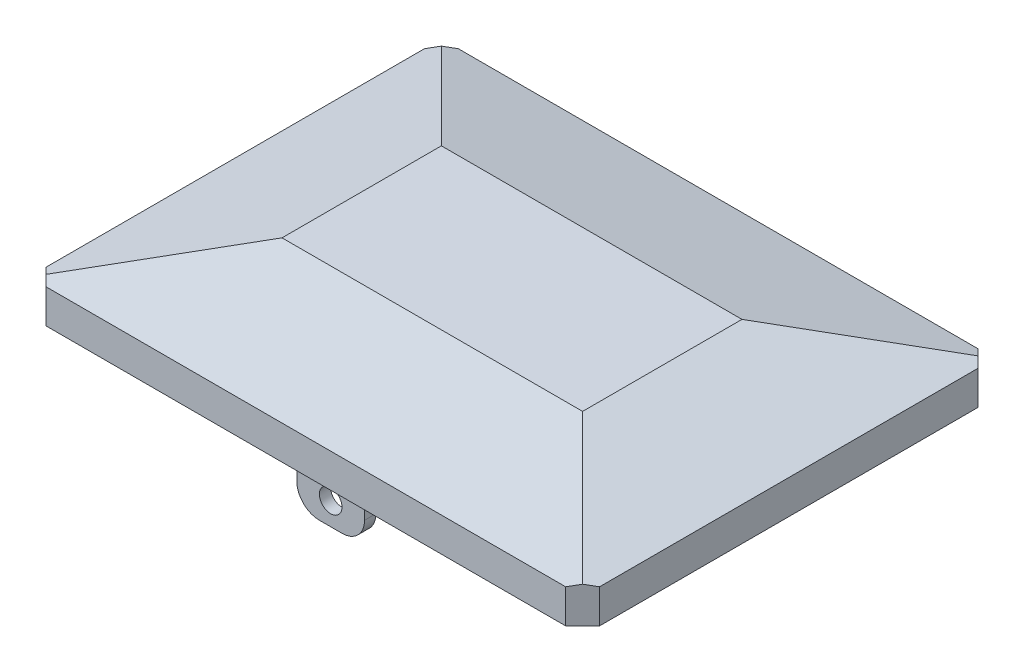
ISO-10303-21;
HEADER;
FILE_DESCRIPTION(('STEP AP214'),'2;1');
FILE_NAME('part.step','',(''),(''),'','','');
FILE_SCHEMA(('AUTOMOTIVE_DESIGN { 1 0 10303 214 1 1 1 1 }'));
ENDSEC;
DATA;
#1=APPLICATION_CONTEXT('core data for automotive mechanical design processes');
#2=APPLICATION_PROTOCOL_DEFINITION('international standard','automotive_design',2000,#1);
#3=PRODUCT_CONTEXT('',#1,'mechanical');
#4=PRODUCT('Part','Part','',(#3));
#5=PRODUCT_RELATED_PRODUCT_CATEGORY('part','',(#4));
#6=PRODUCT_DEFINITION_FORMATION('','',#4);
#7=PRODUCT_DEFINITION_CONTEXT('part definition',#1,'design');
#8=PRODUCT_DEFINITION('design','',#6,#7);
#9=PRODUCT_DEFINITION_SHAPE('','',#8);
#10=(LENGTH_UNIT() NAMED_UNIT(*) SI_UNIT(.MILLI.,.METRE.));
#11=(NAMED_UNIT(*) PLANE_ANGLE_UNIT() SI_UNIT($,.RADIAN.));
#12=(NAMED_UNIT(*) SI_UNIT($,.STERADIAN.) SOLID_ANGLE_UNIT());
#13=UNCERTAINTY_MEASURE_WITH_UNIT(LENGTH_MEASURE(1.E-05),#10,'distance_accuracy_value','');
#14=(GEOMETRIC_REPRESENTATION_CONTEXT(3) GLOBAL_UNCERTAINTY_ASSIGNED_CONTEXT((#13)) GLOBAL_UNIT_ASSIGNED_CONTEXT((#10,
#11,#12)) REPRESENTATION_CONTEXT('',''));
#15=CARTESIAN_POINT('',(0.,0.,0.));
#16=DIRECTION('',(0.,0.,1.));
#17=DIRECTION('',(1.,0.,0.));
#18=AXIS2_PLACEMENT_3D('',#15,#16,#17);
#19=CARTESIAN_POINT('',(0.,0.,0.));
#20=DIRECTION('',(0.,1.,0.));
#21=DIRECTION('',(0.,0.,1.));
#22=AXIS2_PLACEMENT_3D('',#19,#20,#21);
#23=PLANE('',#22);
#24=DIRECTION('',(-1.,0.,0.));
#25=VECTOR('',#24,1.);
#26=CARTESIAN_POINT('',(-1.5,0.,-8.025));
#27=LINE('',#26,#25);
#28=CARTESIAN_POINT('',(1.5,0.,-8.025));
#29=VERTEX_POINT('',#28);
#30=CARTESIAN_POINT('',(-1.5,0.,-8.025));
#31=VERTEX_POINT('',#30);
#32=EDGE_CURVE('E211',#29,#31,#27,.T.);
#33=ORIENTED_EDGE('',*,*,#32,.T.);
#34=DIRECTION('',(0.,0.,1.));
#35=VECTOR('',#34,1.);
#36=CARTESIAN_POINT('',(-1.5,0.,-7.525));
#37=LINE('',#36,#35);
#38=CARTESIAN_POINT('',(-1.5,0.,-7.525));
#39=VERTEX_POINT('',#38);
#40=EDGE_CURVE('E221',#31,#39,#37,.T.);
#41=ORIENTED_EDGE('',*,*,#40,.T.);
#42=DIRECTION('',(1.,0.,0.));
#43=VECTOR('',#42,1.);
#44=CARTESIAN_POINT('',(1.5,0.,-7.525));
#45=LINE('',#44,#43);
#46=CARTESIAN_POINT('',(1.5,0.,-7.525));
#47=VERTEX_POINT('',#46);
#48=EDGE_CURVE('E234',#39,#47,#45,.T.);
#49=ORIENTED_EDGE('',*,*,#48,.T.);
#50=DIRECTION('',(0.,0.,-1.));
#51=VECTOR('',#50,1.);
#52=CARTESIAN_POINT('',(1.5,0.,-8.025));
#53=LINE('',#52,#51);
#54=EDGE_CURVE('E232',#47,#29,#53,.T.);
#55=ORIENTED_EDGE('',*,*,#54,.T.);
#56=EDGE_LOOP('',(#33,#41,#49,#55));
#57=FACE_BOUND('',#56,.T.);
#58=DIRECTION('',(0.,0.,1.));
#59=VECTOR('',#58,1.);
#60=CARTESIAN_POINT('',(-12.25,0.,-9.125));
#61=LINE('',#60,#59);
#62=CARTESIAN_POINT('',(-12.25,0.,-8.375));
#63=VERTEX_POINT('',#62);
#64=CARTESIAN_POINT('',(-12.25,0.,8.375));
#65=VERTEX_POINT('',#64);
#66=EDGE_CURVE('E278',#63,#65,#61,.T.);
#67=ORIENTED_EDGE('',*,*,#66,.F.);
#68=DIRECTION('',(-0.707106781186549,0.,0.707106781186546));
#69=VECTOR('',#68,1.);
#70=CARTESIAN_POINT('',(-12.25,0.,-8.375));
#71=LINE('',#70,#69);
#72=CARTESIAN_POINT('',(-11.5,0.,-9.125));
#73=VERTEX_POINT('',#72);
#74=EDGE_CURVE('E295',#63,#73,#71,.F.);
#75=ORIENTED_EDGE('',*,*,#74,.T.);
#76=DIRECTION('',(-1.,0.,0.));
#77=VECTOR('',#76,1.);
#78=CARTESIAN_POINT('',(-12.25,0.,-9.125));
#79=LINE('',#78,#77);
#80=CARTESIAN_POINT('',(11.5,0.,-9.125));
#81=VERTEX_POINT('',#80);
#82=EDGE_CURVE('E274',#81,#73,#79,.T.);
#83=ORIENTED_EDGE('',*,*,#82,.F.);
#84=DIRECTION('',(-0.707106781186548,0.,-0.707106781186548));
#85=VECTOR('',#84,1.);
#86=CARTESIAN_POINT('',(11.5,0.,-9.125));
#87=LINE('',#86,#85);
#88=CARTESIAN_POINT('',(12.25,0.,-8.375));
#89=VERTEX_POINT('',#88);
#90=EDGE_CURVE('E293',#81,#89,#87,.F.);
#91=ORIENTED_EDGE('',*,*,#90,.T.);
#92=DIRECTION('',(0.,0.,-1.));
#93=VECTOR('',#92,1.);
#94=CARTESIAN_POINT('',(12.25,0.,-9.125));
#95=LINE('',#94,#93);
#96=CARTESIAN_POINT('',(12.25,0.,8.37499999999999));
#97=VERTEX_POINT('',#96);
#98=EDGE_CURVE('E271',#97,#89,#95,.T.);
#99=ORIENTED_EDGE('',*,*,#98,.F.);
#100=DIRECTION('',(0.707106781186549,0.,-0.707106781186546));
#101=VECTOR('',#100,1.);
#102=CARTESIAN_POINT('',(12.25,0.,8.37499999999999));
#103=LINE('',#102,#101);
#104=CARTESIAN_POINT('',(11.5,0.,9.125));
#105=VERTEX_POINT('',#104);
#106=EDGE_CURVE('E291',#97,#105,#103,.F.);
#107=ORIENTED_EDGE('',*,*,#106,.T.);
#108=DIRECTION('',(1.,0.,0.));
#109=VECTOR('',#108,1.);
#110=CARTESIAN_POINT('',(-12.25,0.,9.125));
#111=LINE('',#110,#109);
#112=CARTESIAN_POINT('',(-11.5,0.,9.125));
#113=VERTEX_POINT('',#112);
#114=EDGE_CURVE('E281',#113,#105,#111,.T.);
#115=ORIENTED_EDGE('',*,*,#114,.F.);
#116=DIRECTION('',(0.707106781186548,0.,0.707106781186548));
#117=VECTOR('',#116,1.);
#118=CARTESIAN_POINT('',(-11.5,0.,9.125));
#119=LINE('',#118,#117);
#120=EDGE_CURVE('E289',#113,#65,#119,.F.);
#121=ORIENTED_EDGE('',*,*,#120,.T.);
#122=EDGE_LOOP('',(#67,#75,#83,#91,#99,#107,#115,#121));
#123=FACE_BOUND('',#122,.T.);
#124=DIRECTION('',(0.,0.,-1.));
#125=VECTOR('',#124,1.);
#126=CARTESIAN_POINT('',(-1.5,0.,7.525));
#127=LINE('',#126,#125);
#128=CARTESIAN_POINT('',(-1.5,0.,8.025));
#129=VERTEX_POINT('',#128);
#130=CARTESIAN_POINT('',(-1.5,0.,7.525));
#131=VERTEX_POINT('',#130);
#132=EDGE_CURVE('E217',#129,#131,#127,.T.);
#133=ORIENTED_EDGE('',*,*,#132,.F.);
#134=DIRECTION('',(-1.,0.,0.));
#135=VECTOR('',#134,1.);
#136=CARTESIAN_POINT('',(-1.5,0.,8.025));
#137=LINE('',#136,#135);
#138=CARTESIAN_POINT('',(1.5,0.,8.025));
#139=VERTEX_POINT('',#138);
#140=EDGE_CURVE('E249',#139,#129,#137,.T.);
#141=ORIENTED_EDGE('',*,*,#140,.F.);
#142=DIRECTION('',(0.,0.,1.));
#143=VECTOR('',#142,1.);
#144=CARTESIAN_POINT('',(1.5,0.,8.025));
#145=LINE('',#144,#143);
#146=CARTESIAN_POINT('',(1.5,0.,7.525));
#147=VERTEX_POINT('',#146);
#148=EDGE_CURVE('E258',#147,#139,#145,.T.);
#149=ORIENTED_EDGE('',*,*,#148,.F.);
#150=DIRECTION('',(1.,0.,0.));
#151=VECTOR('',#150,1.);
#152=CARTESIAN_POINT('',(1.5,0.,7.525));
#153=LINE('',#152,#151);
#154=EDGE_CURVE('E255',#131,#147,#153,.T.);
#155=ORIENTED_EDGE('',*,*,#154,.F.);
#156=EDGE_LOOP('',(#133,#141,#149,#155));
#157=FACE_BOUND('',#156,.T.);
#158=ADVANCED_FACE('F43',(#57,#123,#157),#23,.F.);
#159=CARTESIAN_POINT('',(12.25,3.,-9.125));
#160=DIRECTION('',(-1.,0.,0.));
#161=DIRECTION('',(0.,0.,1.));
#162=AXIS2_PLACEMENT_3D('',#159,#160,#161);
#163=PLANE('',#162);
#164=DIRECTION('',(0.,1.,0.));
#165=VECTOR('',#164,1.);
#166=CARTESIAN_POINT('',(12.25,3.,-8.375));
#167=LINE('',#166,#165);
#168=CARTESIAN_POINT('',(12.25,1.5,-8.375));
#169=VERTEX_POINT('',#168);
#170=EDGE_CURVE('E304',#89,#169,#167,.T.);
#171=ORIENTED_EDGE('',*,*,#170,.T.);
#172=DIRECTION('',(0.,0.,1.));
#173=VECTOR('',#172,1.);
#174=CARTESIAN_POINT('',(12.25,1.5,8.37499999999999));
#175=LINE('',#174,#173);
#176=CARTESIAN_POINT('',(12.25,1.5,8.37499999999999));
#177=VERTEX_POINT('',#176);
#178=EDGE_CURVE('E325',#169,#177,#175,.T.);
#179=ORIENTED_EDGE('',*,*,#178,.T.);
#180=DIRECTION('',(0.,-1.,0.));
#181=VECTOR('',#180,1.);
#182=CARTESIAN_POINT('',(12.25,3.,8.37499999999999));
#183=LINE('',#182,#181);
#184=EDGE_CURVE('E302',#177,#97,#183,.T.);
#185=ORIENTED_EDGE('',*,*,#184,.T.);
#186=ORIENTED_EDGE('',*,*,#98,.T.);
#187=EDGE_LOOP('',(#171,#179,#185,#186));
#188=FACE_BOUND('',#187,.T.);
#189=ADVANCED_FACE('F402',(#188),#163,.F.);
#190=CARTESIAN_POINT('',(-12.25,3.,-9.125));
#191=DIRECTION('',(0.,0.,1.));
#192=DIRECTION('',(1.,0.,0.));
#193=AXIS2_PLACEMENT_3D('',#190,#191,#192);
#194=PLANE('',#193);
#195=DIRECTION('',(0.,1.,0.));
#196=VECTOR('',#195,1.);
#197=CARTESIAN_POINT('',(-11.5,3.,-9.125));
#198=LINE('',#197,#196);
#199=CARTESIAN_POINT('',(-11.5,1.5,-9.125));
#200=VERTEX_POINT('',#199);
#201=EDGE_CURVE('E299',#73,#200,#198,.T.);
#202=ORIENTED_EDGE('',*,*,#201,.T.);
#203=DIRECTION('',(1.,0.,0.));
#204=VECTOR('',#203,1.);
#205=CARTESIAN_POINT('',(11.5,1.5,-9.125));
#206=LINE('',#205,#204);
#207=CARTESIAN_POINT('',(11.5,1.5,-9.125));
#208=VERTEX_POINT('',#207);
#209=EDGE_CURVE('E344',#200,#208,#206,.T.);
#210=ORIENTED_EDGE('',*,*,#209,.T.);
#211=DIRECTION('',(0.,-1.,0.));
#212=VECTOR('',#211,1.);
#213=CARTESIAN_POINT('',(11.5,3.,-9.125));
#214=LINE('',#213,#212);
#215=EDGE_CURVE('E297',#208,#81,#214,.T.);
#216=ORIENTED_EDGE('',*,*,#215,.T.);
#217=ORIENTED_EDGE('',*,*,#82,.T.);
#218=EDGE_LOOP('',(#202,#210,#216,#217));
#219=FACE_BOUND('',#218,.T.);
#220=ADVANCED_FACE('F409',(#219),#194,.F.);
#221=CARTESIAN_POINT('',(-12.25,3.,-9.125));
#222=DIRECTION('',(1.,0.,0.));
#223=DIRECTION('',(0.,0.,-1.));
#224=AXIS2_PLACEMENT_3D('',#221,#222,#223);
#225=PLANE('',#224);
#226=DIRECTION('',(0.,1.,0.));
#227=VECTOR('',#226,1.);
#228=CARTESIAN_POINT('',(-12.25,3.,8.375));
#229=LINE('',#228,#227);
#230=CARTESIAN_POINT('',(-12.25,1.5,8.375));
#231=VERTEX_POINT('',#230);
#232=EDGE_CURVE('E284',#65,#231,#229,.T.);
#233=ORIENTED_EDGE('',*,*,#232,.T.);
#234=DIRECTION('',(0.,0.,-1.));
#235=VECTOR('',#234,1.);
#236=CARTESIAN_POINT('',(-12.25,1.5,-8.375));
#237=LINE('',#236,#235);
#238=CARTESIAN_POINT('',(-12.25,1.5,-8.375));
#239=VERTEX_POINT('',#238);
#240=EDGE_CURVE('E338',#231,#239,#237,.T.);
#241=ORIENTED_EDGE('',*,*,#240,.T.);
#242=DIRECTION('',(0.,-1.,0.));
#243=VECTOR('',#242,1.);
#244=CARTESIAN_POINT('',(-12.25,3.,-8.375));
#245=LINE('',#244,#243);
#246=EDGE_CURVE('E287',#239,#63,#245,.T.);
#247=ORIENTED_EDGE('',*,*,#246,.T.);
#248=ORIENTED_EDGE('',*,*,#66,.T.);
#249=EDGE_LOOP('',(#233,#241,#247,#248));
#250=FACE_BOUND('',#249,.T.);
#251=ADVANCED_FACE('F419',(#250),#225,.F.);
#252=CARTESIAN_POINT('',(-12.25,3.,9.125));
#253=DIRECTION('',(0.,0.,-1.));
#254=DIRECTION('',(-1.,0.,0.));
#255=AXIS2_PLACEMENT_3D('',#252,#253,#254);
#256=PLANE('',#255);
#257=DIRECTION('',(0.,1.,0.));
#258=VECTOR('',#257,1.);
#259=CARTESIAN_POINT('',(11.5,3.,9.125));
#260=LINE('',#259,#258);
#261=CARTESIAN_POINT('',(11.5,1.5,9.125));
#262=VERTEX_POINT('',#261);
#263=EDGE_CURVE('E309',#105,#262,#260,.T.);
#264=ORIENTED_EDGE('',*,*,#263,.T.);
#265=DIRECTION('',(-1.,0.,0.));
#266=VECTOR('',#265,1.);
#267=CARTESIAN_POINT('',(-11.5,1.5,9.125));
#268=LINE('',#267,#266);
#269=CARTESIAN_POINT('',(-11.5,1.5,9.125));
#270=VERTEX_POINT('',#269);
#271=EDGE_CURVE('E332',#262,#270,#268,.T.);
#272=ORIENTED_EDGE('',*,*,#271,.T.);
#273=DIRECTION('',(0.,-1.,0.));
#274=VECTOR('',#273,1.);
#275=CARTESIAN_POINT('',(-11.5,3.,9.125));
#276=LINE('',#275,#274);
#277=EDGE_CURVE('E307',#270,#113,#276,.T.);
#278=ORIENTED_EDGE('',*,*,#277,.T.);
#279=ORIENTED_EDGE('',*,*,#114,.T.);
#280=EDGE_LOOP('',(#264,#272,#278,#279));
#281=FACE_BOUND('',#280,.T.);
#282=ADVANCED_FACE('F416',(#281),#256,.F.);
#283=CARTESIAN_POINT('',(0.,3.,0.));
#284=DIRECTION('',(0.,1.,0.));
#285=DIRECTION('',(0.,0.,1.));
#286=AXIS2_PLACEMENT_3D('',#283,#284,#285);
#287=PLANE('',#286);
#288=DIRECTION('',(1.,0.,0.));
#289=VECTOR('',#288,1.);
#290=CARTESIAN_POINT('',(11.5,3.,3.52692378864669));
#291=LINE('',#290,#289);
#292=CARTESIAN_POINT('',(-6.6519237886467,3.,3.52692378864669));
#293=VERTEX_POINT('',#292);
#294=CARTESIAN_POINT('',(6.6519237886467,3.,3.52692378864669));
#295=VERTEX_POINT('',#294);
#296=EDGE_CURVE('E316',#293,#295,#291,.T.);
#297=ORIENTED_EDGE('',*,*,#296,.T.);
#298=DIRECTION('',(0.,0.,-1.));
#299=VECTOR('',#298,1.);
#300=CARTESIAN_POINT('',(6.65192378864669,3.,-8.37499999999999));
#301=LINE('',#300,#299);
#302=CARTESIAN_POINT('',(6.65192378864669,3.,-3.5269237886467));
#303=VERTEX_POINT('',#302);
#304=EDGE_CURVE('E318',#295,#303,#301,.T.);
#305=ORIENTED_EDGE('',*,*,#304,.T.);
#306=DIRECTION('',(-1.,0.,0.));
#307=VECTOR('',#306,1.);
#308=CARTESIAN_POINT('',(-11.5,3.,-3.5269237886467));
#309=LINE('',#308,#307);
#310=CARTESIAN_POINT('',(-6.6519237886467,3.,-3.5269237886467));
#311=VERTEX_POINT('',#310);
#312=EDGE_CURVE('E312',#303,#311,#309,.T.);
#313=ORIENTED_EDGE('',*,*,#312,.T.);
#314=DIRECTION('',(0.,0.,1.));
#315=VECTOR('',#314,1.);
#316=CARTESIAN_POINT('',(-6.6519237886467,3.,8.37499999999999));
#317=LINE('',#316,#315);
#318=EDGE_CURVE('E314',#311,#293,#317,.T.);
#319=ORIENTED_EDGE('',*,*,#318,.T.);
#320=EDGE_LOOP('',(#297,#305,#313,#319));
#321=FACE_BOUND('',#320,.T.);
#322=ADVANCED_FACE('F414',(#321),#287,.T.);
#323=CARTESIAN_POINT('',(-12.25,3.,-8.375));
#324=DIRECTION('',(0.707106781186546,0.,0.707106781186549));
#325=DIRECTION('',(0.,-1.,0.));
#326=AXIS2_PLACEMENT_3D('',#323,#324,#325);
#327=PLANE('',#326);
#328=ORIENTED_EDGE('',*,*,#246,.F.);
#329=DIRECTION('',(-0.694746590606867,-0.186156787897386,0.694746590606864));
#330=VECTOR('',#329,1.);
#331=CARTESIAN_POINT('',(-12.056002309435,1.55198152452041,-8.56899769056505));
#332=LINE('',#331,#330);
#333=CARTESIAN_POINT('',(-11.875,1.60048094716167,-8.75));
#334=VERTEX_POINT('',#333);
#335=EDGE_CURVE('E342',#239,#334,#332,.F.);
#336=ORIENTED_EDGE('',*,*,#335,.T.);
#337=DIRECTION('',(-0.694746590606867,0.186156787897386,0.694746590606864));
#338=VECTOR('',#337,1.);
#339=CARTESIAN_POINT('',(-12.4180069283049,1.74597921508546,-8.20699307169515));
#340=LINE('',#339,#338);
#341=EDGE_CURVE('E340',#334,#200,#340,.F.);
#342=ORIENTED_EDGE('',*,*,#341,.T.);
#343=ORIENTED_EDGE('',*,*,#201,.F.);
#344=ORIENTED_EDGE('',*,*,#74,.F.);
#345=EDGE_LOOP('',(#328,#336,#342,#343,#344));
#346=FACE_BOUND('',#345,.T.);
#347=ADVANCED_FACE('F428',(#346),#327,.F.);
#348=CARTESIAN_POINT('',(11.5,3.,-9.125));
#349=DIRECTION('',(-0.707106781186548,0.,0.707106781186548));
#350=DIRECTION('',(0.,-1.,0.));
#351=AXIS2_PLACEMENT_3D('',#348,#349,#350);
#352=PLANE('',#351);
#353=DIRECTION('',(-0.694746590606866,-0.186156787897386,-0.694746590606866));
#354=VECTOR('',#353,1.);
#355=CARTESIAN_POINT('',(11.693997690565,1.55198152452041,-8.93100230943495));
#356=LINE('',#355,#354);
#357=CARTESIAN_POINT('',(11.875,1.60048094716167,-8.75));
#358=VERTEX_POINT('',#357);
#359=EDGE_CURVE('E321',#208,#358,#356,.F.);
#360=ORIENTED_EDGE('',*,*,#359,.T.);
#361=DIRECTION('',(-0.694746590606866,0.186156787897386,-0.694746590606866));
#362=VECTOR('',#361,1.);
#363=CARTESIAN_POINT('',(11.3319930716951,1.74597921508546,-9.29300692830485));
#364=LINE('',#363,#362);
#365=EDGE_CURVE('E323',#358,#169,#364,.F.);
#366=ORIENTED_EDGE('',*,*,#365,.T.);
#367=ORIENTED_EDGE('',*,*,#170,.F.);
#368=ORIENTED_EDGE('',*,*,#90,.F.);
#369=ORIENTED_EDGE('',*,*,#215,.F.);
#370=EDGE_LOOP('',(#360,#366,#367,#368,#369));
#371=FACE_BOUND('',#370,.T.);
#372=ADVANCED_FACE('F434',(#371),#352,.F.);
#373=CARTESIAN_POINT('',(12.25,3.,8.37499999999999));
#374=DIRECTION('',(-0.707106781186546,0.,-0.707106781186549));
#375=DIRECTION('',(0.,-1.,0.));
#376=AXIS2_PLACEMENT_3D('',#373,#374,#375);
#377=PLANE('',#376);
#378=ORIENTED_EDGE('',*,*,#184,.F.);
#379=DIRECTION('',(0.694746590606867,-0.186156787897387,-0.694746590606864));
#380=VECTOR('',#379,1.);
#381=CARTESIAN_POINT('',(12.0560023094349,1.55198152452041,8.56899769056504));
#382=LINE('',#381,#380);
#383=CARTESIAN_POINT('',(11.875,1.60048094716167,8.74999999999999));
#384=VERTEX_POINT('',#383);
#385=EDGE_CURVE('E330',#177,#384,#382,.F.);
#386=ORIENTED_EDGE('',*,*,#385,.T.);
#387=DIRECTION('',(0.694746590606867,0.186156787897386,-0.694746590606864));
#388=VECTOR('',#387,1.);
#389=CARTESIAN_POINT('',(12.4180069283048,1.74597921508546,8.20699307169515));
#390=LINE('',#389,#388);
#391=EDGE_CURVE('E328',#384,#262,#390,.F.);
#392=ORIENTED_EDGE('',*,*,#391,.T.);
#393=ORIENTED_EDGE('',*,*,#263,.F.);
#394=ORIENTED_EDGE('',*,*,#106,.F.);
#395=EDGE_LOOP('',(#378,#386,#392,#393,#394));
#396=FACE_BOUND('',#395,.T.);
#397=ADVANCED_FACE('F441',(#396),#377,.F.);
#398=CARTESIAN_POINT('',(-11.5,3.,9.125));
#399=DIRECTION('',(0.707106781186547,0.,-0.707106781186547));
#400=DIRECTION('',(0.,-1.,0.));
#401=AXIS2_PLACEMENT_3D('',#398,#399,#400);
#402=PLANE('',#401);
#403=ORIENTED_EDGE('',*,*,#277,.F.);
#404=DIRECTION('',(0.694746590606866,-0.186156787897386,0.694746590606866));
#405=VECTOR('',#404,1.);
#406=CARTESIAN_POINT('',(-11.6939976905651,1.55198152452041,8.93100230943495));
#407=LINE('',#406,#405);
#408=CARTESIAN_POINT('',(-11.875,1.60048094716167,8.74999999999999));
#409=VERTEX_POINT('',#408);
#410=EDGE_CURVE('E336',#270,#409,#407,.F.);
#411=ORIENTED_EDGE('',*,*,#410,.T.);
#412=DIRECTION('',(0.694746590606866,0.186156787897386,0.694746590606866));
#413=VECTOR('',#412,1.);
#414=CARTESIAN_POINT('',(-11.3319930716952,1.74597921508546,9.29300692830485));
#415=LINE('',#414,#413);
#416=EDGE_CURVE('E334',#409,#231,#415,.F.);
#417=ORIENTED_EDGE('',*,*,#416,.T.);
#418=ORIENTED_EDGE('',*,*,#232,.F.);
#419=ORIENTED_EDGE('',*,*,#120,.F.);
#420=EDGE_LOOP('',(#403,#411,#417,#418,#419));
#421=FACE_BOUND('',#420,.T.);
#422=ADVANCED_FACE('F448',(#421),#402,.F.);
#423=CARTESIAN_POINT('',(-6.6519237886467,3.,0.));
#424=DIRECTION('',(-0.258819045102521,0.965925826289068,0.));
#425=DIRECTION('',(0.,0.,-1.));
#426=AXIS2_PLACEMENT_3D('',#423,#424,#425);
#427=PLANE('',#426);
#428=ORIENTED_EDGE('',*,*,#240,.F.);
#429=ORIENTED_EDGE('',*,*,#416,.F.);
#430=DIRECTION('',(-0.694746590606866,-0.186156787897386,0.694746590606866));
#431=VECTOR('',#430,1.);
#432=CARTESIAN_POINT('',(-3.44122094083249,3.86030523520813,0.316220940832482));
#433=LINE('',#432,#431);
#434=EDGE_CURVE('E275',#293,#409,#433,.T.);
#435=ORIENTED_EDGE('',*,*,#434,.F.);
#436=ORIENTED_EDGE('',*,*,#318,.F.);
#437=DIRECTION('',(-0.694746590606866,-0.186156787897386,-0.694746590606865));
#438=VECTOR('',#437,1.);
#439=CARTESIAN_POINT('',(-4.94957351945707,3.45614337986427,-1.82457351945707));
#440=LINE('',#439,#438);
#441=EDGE_CURVE('E351',#334,#311,#440,.F.);
#442=ORIENTED_EDGE('',*,*,#441,.F.);
#443=ORIENTED_EDGE('',*,*,#335,.F.);
#444=EDGE_LOOP('',(#428,#429,#435,#436,#442,#443));
#445=FACE_BOUND('',#444,.T.);
#446=ADVANCED_FACE('F455',(#445),#427,.T.);
#447=CARTESIAN_POINT('',(0.,3.,3.52692378864669));
#448=DIRECTION('',(0.,0.965925826289068,0.258819045102521));
#449=DIRECTION('',(-1.,0.,0.));
#450=AXIS2_PLACEMENT_3D('',#447,#448,#449);
#451=PLANE('',#450);
#452=ORIENTED_EDGE('',*,*,#271,.F.);
#453=ORIENTED_EDGE('',*,*,#391,.F.);
#454=DIRECTION('',(0.694746590606866,-0.186156787897386,0.694746590606866));
#455=VECTOR('',#454,1.);
#456=CARTESIAN_POINT('',(4.94957351945707,3.45614337986427,1.82457351945706));
#457=LINE('',#456,#455);
#458=EDGE_CURVE('E348',#295,#384,#457,.T.);
#459=ORIENTED_EDGE('',*,*,#458,.F.);
#460=ORIENTED_EDGE('',*,*,#296,.F.);
#461=ORIENTED_EDGE('',*,*,#434,.T.);
#462=ORIENTED_EDGE('',*,*,#410,.F.);
#463=EDGE_LOOP('',(#452,#453,#459,#460,#461,#462));
#464=FACE_BOUND('',#463,.T.);
#465=ADVANCED_FACE('F472',(#464),#451,.T.);
#466=CARTESIAN_POINT('',(0.,3.,-3.5269237886467));
#467=DIRECTION('',(0.,0.965925826289068,-0.258819045102521));
#468=DIRECTION('',(1.,0.,0.));
#469=AXIS2_PLACEMENT_3D('',#466,#467,#468);
#470=PLANE('',#469);
#471=ORIENTED_EDGE('',*,*,#441,.T.);
#472=ORIENTED_EDGE('',*,*,#312,.F.);
#473=DIRECTION('',(0.694746590606866,-0.186156787897386,-0.694746590606866));
#474=VECTOR('',#473,1.);
#475=CARTESIAN_POINT('',(3.44122094083249,3.86030523520812,-0.316220940832493));
#476=LINE('',#475,#474);
#477=EDGE_CURVE('E270',#358,#303,#476,.F.);
#478=ORIENTED_EDGE('',*,*,#477,.F.);
#479=ORIENTED_EDGE('',*,*,#359,.F.);
#480=ORIENTED_EDGE('',*,*,#209,.F.);
#481=ORIENTED_EDGE('',*,*,#341,.F.);
#482=EDGE_LOOP('',(#471,#472,#478,#479,#480,#481));
#483=FACE_BOUND('',#482,.T.);
#484=ADVANCED_FACE('F465',(#483),#470,.T.);
#485=CARTESIAN_POINT('',(6.6519237886467,3.,0.));
#486=DIRECTION('',(0.258819045102521,0.965925826289068,0.));
#487=DIRECTION('',(0.,0.,1.));
#488=AXIS2_PLACEMENT_3D('',#485,#486,#487);
#489=PLANE('',#488);
#490=ORIENTED_EDGE('',*,*,#385,.F.);
#491=ORIENTED_EDGE('',*,*,#178,.F.);
#492=ORIENTED_EDGE('',*,*,#365,.F.);
#493=ORIENTED_EDGE('',*,*,#477,.T.);
#494=ORIENTED_EDGE('',*,*,#304,.F.);
#495=ORIENTED_EDGE('',*,*,#458,.T.);
#496=EDGE_LOOP('',(#490,#491,#492,#493,#494,#495));
#497=FACE_BOUND('',#496,.T.);
#498=ADVANCED_FACE('F458',(#497),#489,.T.);
#499=CARTESIAN_POINT('',(-1.5,-2.5,7.525));
#500=DIRECTION('',(1.,0.,0.));
#501=DIRECTION('',(0.,0.,-1.));
#502=AXIS2_PLACEMENT_3D('',#499,#500,#501);
#503=PLANE('',#502);
#504=DIRECTION('',(0.,1.,0.));
#505=VECTOR('',#504,1.);
#506=CARTESIAN_POINT('',(-1.5,-2.5,7.525));
#507=LINE('',#506,#505);
#508=CARTESIAN_POINT('',(-1.5,-1.5,7.525));
#509=VERTEX_POINT('',#508);
#510=EDGE_CURVE('E268',#509,#131,#507,.T.);
#511=ORIENTED_EDGE('',*,*,#510,.F.);
#512=DIRECTION('',(0.,0.,-1.));
#513=VECTOR('',#512,1.);
#514=CARTESIAN_POINT('',(-1.5,-1.5,7.525));
#515=LINE('',#514,#513);
#516=CARTESIAN_POINT('',(-1.5,-1.5,8.025));
#517=VERTEX_POINT('',#516);
#518=EDGE_CURVE('E365',#509,#517,#515,.F.);
#519=ORIENTED_EDGE('',*,*,#518,.T.);
#520=DIRECTION('',(0.,1.,0.));
#521=VECTOR('',#520,1.);
#522=CARTESIAN_POINT('',(-1.5,-2.5,8.025));
#523=LINE('',#522,#521);
#524=EDGE_CURVE('E252',#517,#129,#523,.T.);
#525=ORIENTED_EDGE('',*,*,#524,.T.);
#526=ORIENTED_EDGE('',*,*,#132,.T.);
#527=EDGE_LOOP('',(#511,#519,#525,#526));
#528=FACE_BOUND('',#527,.T.);
#529=ADVANCED_FACE('F464',(#528),#503,.F.);
#530=CARTESIAN_POINT('',(1.5,-2.5,7.525));
#531=DIRECTION('',(0.,0.,1.));
#532=DIRECTION('',(1.,0.,0.));
#533=AXIS2_PLACEMENT_3D('',#530,#531,#532);
#534=PLANE('',#533);
#535=CARTESIAN_POINT('',(0.,-1.5,7.525));
#536=DIRECTION('',(0.,0.,1.));
#537=DIRECTION('',(1.,0.,0.));
#538=AXIS2_PLACEMENT_3D('',#535,#536,#537);
#539=CIRCLE('',#538,0.5);
#540=CARTESIAN_POINT('',(0.5,-1.5,7.525));
#541=VERTEX_POINT('',#540);
#542=EDGE_CURVE('E729',#541,#541,#539,.F.);
#543=ORIENTED_EDGE('',*,*,#542,.F.);
#544=EDGE_LOOP('',(#543));
#545=FACE_BOUND('',#544,.T.);
#546=DIRECTION('',(1.,0.,0.));
#547=VECTOR('',#546,1.);
#548=CARTESIAN_POINT('',(1.5,-2.5,7.525));
#549=LINE('',#548,#547);
#550=CARTESIAN_POINT('',(-0.5,-2.5,7.525));
#551=VERTEX_POINT('',#550);
#552=CARTESIAN_POINT('',(0.5,-2.5,7.525));
#553=VERTEX_POINT('',#552);
#554=EDGE_CURVE('E245',#551,#553,#549,.T.);
#555=ORIENTED_EDGE('',*,*,#554,.F.);
#556=CARTESIAN_POINT('',(-0.5,-1.5,7.525));
#557=DIRECTION('',(0.,0.,1.));
#558=DIRECTION('',(1.,0.,0.));
#559=AXIS2_PLACEMENT_3D('',#556,#557,#558);
#560=CIRCLE('',#559,1.);
#561=EDGE_CURVE('E363',#551,#509,#560,.F.);
#562=ORIENTED_EDGE('',*,*,#561,.T.);
#563=ORIENTED_EDGE('',*,*,#510,.T.);
#564=ORIENTED_EDGE('',*,*,#154,.T.);
#565=DIRECTION('',(0.,1.,0.));
#566=VECTOR('',#565,1.);
#567=CARTESIAN_POINT('',(1.5,-2.5,7.525));
#568=LINE('',#567,#566);
#569=CARTESIAN_POINT('',(1.5,-1.5,7.525));
#570=VERTEX_POINT('',#569);
#571=EDGE_CURVE('E266',#570,#147,#568,.T.);
#572=ORIENTED_EDGE('',*,*,#571,.F.);
#573=CARTESIAN_POINT('',(0.5,-1.5,7.525));
#574=DIRECTION('',(0.,0.,1.));
#575=DIRECTION('',(1.,0.,0.));
#576=AXIS2_PLACEMENT_3D('',#573,#574,#575);
#577=CIRCLE('',#576,1.);
#578=EDGE_CURVE('E361',#570,#553,#577,.F.);
#579=ORIENTED_EDGE('',*,*,#578,.T.);
#580=EDGE_LOOP('',(#555,#562,#563,#564,#572,#579));
#581=FACE_BOUND('',#580,.T.);
#582=ADVANCED_FACE('F499',(#545,#581),#534,.F.);
#583=CARTESIAN_POINT('',(1.5,-2.5,8.025));
#584=DIRECTION('',(-1.,0.,0.));
#585=DIRECTION('',(0.,0.,1.));
#586=AXIS2_PLACEMENT_3D('',#583,#584,#585);
#587=PLANE('',#586);
#588=DIRECTION('',(0.,1.,0.));
#589=VECTOR('',#588,1.);
#590=CARTESIAN_POINT('',(1.5,-2.5,8.025));
#591=LINE('',#590,#589);
#592=CARTESIAN_POINT('',(1.5,-1.5,8.025));
#593=VERTEX_POINT('',#592);
#594=EDGE_CURVE('E264',#593,#139,#591,.T.);
#595=ORIENTED_EDGE('',*,*,#594,.F.);
#596=DIRECTION('',(0.,0.,1.));
#597=VECTOR('',#596,1.);
#598=CARTESIAN_POINT('',(1.5,-1.5,8.025));
#599=LINE('',#598,#597);
#600=EDGE_CURVE('E371',#593,#570,#599,.F.);
#601=ORIENTED_EDGE('',*,*,#600,.T.);
#602=ORIENTED_EDGE('',*,*,#571,.T.);
#603=ORIENTED_EDGE('',*,*,#148,.T.);
#604=EDGE_LOOP('',(#595,#601,#602,#603));
#605=FACE_BOUND('',#604,.T.);
#606=ADVANCED_FACE('F517',(#605),#587,.F.);
#607=CARTESIAN_POINT('',(-1.5,-2.5,8.025));
#608=DIRECTION('',(0.,0.,-1.));
#609=DIRECTION('',(-1.,0.,0.));
#610=AXIS2_PLACEMENT_3D('',#607,#608,#609);
#611=PLANE('',#610);
#612=CARTESIAN_POINT('',(0.,-1.5,8.025));
#613=DIRECTION('',(0.,0.,1.));
#614=DIRECTION('',(1.,0.,0.));
#615=AXIS2_PLACEMENT_3D('',#612,#613,#614);
#616=CIRCLE('',#615,0.5);
#617=CARTESIAN_POINT('',(0.5,-1.5,8.025));
#618=VERTEX_POINT('',#617);
#619=EDGE_CURVE('E726',#618,#618,#616,.T.);
#620=ORIENTED_EDGE('',*,*,#619,.F.);
#621=EDGE_LOOP('',(#620));
#622=FACE_BOUND('',#621,.T.);
#623=ORIENTED_EDGE('',*,*,#524,.F.);
#624=CARTESIAN_POINT('',(-0.5,-1.5,8.025));
#625=DIRECTION('',(0.,0.,-1.));
#626=DIRECTION('',(-1.,0.,0.));
#627=AXIS2_PLACEMENT_3D('',#624,#625,#626);
#628=CIRCLE('',#627,1.);
#629=CARTESIAN_POINT('',(-0.5,-2.5,8.025));
#630=VERTEX_POINT('',#629);
#631=EDGE_CURVE('E369',#517,#630,#628,.F.);
#632=ORIENTED_EDGE('',*,*,#631,.T.);
#633=DIRECTION('',(-1.,0.,0.));
#634=VECTOR('',#633,1.);
#635=CARTESIAN_POINT('',(-1.5,-2.5,8.025));
#636=LINE('',#635,#634);
#637=CARTESIAN_POINT('',(0.5,-2.5,8.025));
#638=VERTEX_POINT('',#637);
#639=EDGE_CURVE('E248',#638,#630,#636,.T.);
#640=ORIENTED_EDGE('',*,*,#639,.F.);
#641=CARTESIAN_POINT('',(0.5,-1.5,8.025));
#642=DIRECTION('',(0.,0.,-1.));
#643=DIRECTION('',(-1.,0.,0.));
#644=AXIS2_PLACEMENT_3D('',#641,#642,#643);
#645=CIRCLE('',#644,1.);
#646=EDGE_CURVE('E367',#638,#593,#645,.F.);
#647=ORIENTED_EDGE('',*,*,#646,.T.);
#648=ORIENTED_EDGE('',*,*,#594,.T.);
#649=ORIENTED_EDGE('',*,*,#140,.T.);
#650=EDGE_LOOP('',(#623,#632,#640,#647,#648,#649));
#651=FACE_BOUND('',#650,.T.);
#652=ADVANCED_FACE('F514',(#622,#651),#611,.F.);
#653=CARTESIAN_POINT('',(0.,-2.5,0.));
#654=DIRECTION('',(0.,1.,0.));
#655=DIRECTION('',(0.,0.,1.));
#656=AXIS2_PLACEMENT_3D('',#653,#654,#655);
#657=PLANE('',#656);
#658=ORIENTED_EDGE('',*,*,#639,.T.);
#659=DIRECTION('',(0.,0.,-1.));
#660=VECTOR('',#659,1.);
#661=CARTESIAN_POINT('',(-0.5,-2.5,0.));
#662=LINE('',#661,#660);
#663=EDGE_CURVE('E358',#630,#551,#662,.T.);
#664=ORIENTED_EDGE('',*,*,#663,.T.);
#665=ORIENTED_EDGE('',*,*,#554,.T.);
#666=DIRECTION('',(0.,0.,1.));
#667=VECTOR('',#666,1.);
#668=CARTESIAN_POINT('',(0.5,-2.5,0.));
#669=LINE('',#668,#667);
#670=EDGE_CURVE('E346',#553,#638,#669,.T.);
#671=ORIENTED_EDGE('',*,*,#670,.T.);
#672=EDGE_LOOP('',(#658,#664,#665,#671));
#673=FACE_BOUND('',#672,.T.);
#674=ADVANCED_FACE('F487',(#673),#657,.F.);
#675=CARTESIAN_POINT('',(-0.5,-1.5,0.));
#676=DIRECTION('',(0.,0.,-1.));
#677=DIRECTION('',(-1.,0.,0.));
#678=AXIS2_PLACEMENT_3D('',#675,#676,#677);
#679=CYLINDRICAL_SURFACE('',#678,1.);
#680=ORIENTED_EDGE('',*,*,#631,.F.);
#681=ORIENTED_EDGE('',*,*,#518,.F.);
#682=ORIENTED_EDGE('',*,*,#561,.F.);
#683=ORIENTED_EDGE('',*,*,#663,.F.);
#684=EDGE_LOOP('',(#680,#681,#682,#683));
#685=FACE_BOUND('',#684,.T.);
#686=ADVANCED_FACE('F484',(#685),#679,.T.);
#687=CARTESIAN_POINT('',(0.5,-1.5,0.));
#688=DIRECTION('',(0.,0.,1.));
#689=DIRECTION('',(1.,0.,0.));
#690=AXIS2_PLACEMENT_3D('',#687,#688,#689);
#691=CYLINDRICAL_SURFACE('',#690,1.);
#692=ORIENTED_EDGE('',*,*,#578,.F.);
#693=ORIENTED_EDGE('',*,*,#600,.F.);
#694=ORIENTED_EDGE('',*,*,#646,.F.);
#695=ORIENTED_EDGE('',*,*,#670,.F.);
#696=EDGE_LOOP('',(#692,#693,#694,#695));
#697=FACE_BOUND('',#696,.T.);
#698=ADVANCED_FACE('F486',(#697),#691,.T.);
#699=CARTESIAN_POINT('',(-1.5,-2.5,-7.525));
#700=DIRECTION('',(-1.,0.,0.));
#701=DIRECTION('',(0.,0.,1.));
#702=AXIS2_PLACEMENT_3D('',#699,#700,#701);
#703=PLANE('',#702);
#704=DIRECTION('',(0.,1.,0.));
#705=VECTOR('',#704,1.);
#706=CARTESIAN_POINT('',(-1.5,-2.5,-8.025));
#707=LINE('',#706,#705);
#708=CARTESIAN_POINT('',(-1.5,-1.5,-8.025));
#709=VERTEX_POINT('',#708);
#710=EDGE_CURVE('E206',#709,#31,#707,.T.);
#711=ORIENTED_EDGE('',*,*,#710,.F.);
#712=DIRECTION('',(0.,0.,1.));
#713=VECTOR('',#712,1.);
#714=CARTESIAN_POINT('',(-1.5,-1.5,-7.525));
#715=LINE('',#714,#713);
#716=CARTESIAN_POINT('',(-1.5,-1.5,-7.525));
#717=VERTEX_POINT('',#716);
#718=EDGE_CURVE('E373',#709,#717,#715,.T.);
#719=ORIENTED_EDGE('',*,*,#718,.T.);
#720=DIRECTION('',(0.,1.,0.));
#721=VECTOR('',#720,1.);
#722=CARTESIAN_POINT('',(-1.5,-2.5,-7.525));
#723=LINE('',#722,#721);
#724=EDGE_CURVE('E224',#717,#39,#723,.T.);
#725=ORIENTED_EDGE('',*,*,#724,.T.);
#726=ORIENTED_EDGE('',*,*,#40,.F.);
#727=EDGE_LOOP('',(#711,#719,#725,#726));
#728=FACE_BOUND('',#727,.T.);
#729=ADVANCED_FACE('F222',(#728),#703,.T.);
#730=CARTESIAN_POINT('',(-1.5,-2.5,-8.025));
#731=DIRECTION('',(0.,0.,-1.));
#732=DIRECTION('',(-1.,0.,0.));
#733=AXIS2_PLACEMENT_3D('',#730,#731,#732);
#734=PLANE('',#733);
#735=CARTESIAN_POINT('',(0.,-1.5,-8.025));
#736=DIRECTION('',(0.,0.,-1.));
#737=DIRECTION('',(-1.,0.,0.));
#738=AXIS2_PLACEMENT_3D('',#735,#736,#737);
#739=CIRCLE('',#738,0.75);
#740=CARTESIAN_POINT('',(-0.75,-1.5,-8.025));
#741=VERTEX_POINT('',#740);
#742=EDGE_CURVE('E730',#741,#741,#739,.T.);
#743=ORIENTED_EDGE('',*,*,#742,.F.);
#744=EDGE_LOOP('',(#743));
#745=FACE_BOUND('',#744,.T.);
#746=DIRECTION('',(-1.,0.,0.));
#747=VECTOR('',#746,1.);
#748=CARTESIAN_POINT('',(-1.5,-2.5,-8.025));
#749=LINE('',#748,#747);
#750=CARTESIAN_POINT('',(0.5,-2.5,-8.025));
#751=VERTEX_POINT('',#750);
#752=CARTESIAN_POINT('',(-0.5,-2.5,-8.025));
#753=VERTEX_POINT('',#752);
#754=EDGE_CURVE('E239',#751,#753,#749,.T.);
#755=ORIENTED_EDGE('',*,*,#754,.T.);
#756=CARTESIAN_POINT('',(-0.5,-1.5,-8.025));
#757=DIRECTION('',(0.,0.,-1.));
#758=DIRECTION('',(-1.,0.,0.));
#759=AXIS2_PLACEMENT_3D('',#756,#757,#758);
#760=CIRCLE('',#759,1.);
#761=EDGE_CURVE('E51',#753,#709,#760,.T.);
#762=ORIENTED_EDGE('',*,*,#761,.T.);
#763=ORIENTED_EDGE('',*,*,#710,.T.);
#764=ORIENTED_EDGE('',*,*,#32,.F.);
#765=DIRECTION('',(0.,1.,0.));
#766=VECTOR('',#765,1.);
#767=CARTESIAN_POINT('',(1.5,-2.5,-8.025));
#768=LINE('',#767,#766);
#769=CARTESIAN_POINT('',(1.5,-1.5,-8.025));
#770=VERTEX_POINT('',#769);
#771=EDGE_CURVE('E218',#770,#29,#768,.T.);
#772=ORIENTED_EDGE('',*,*,#771,.F.);
#773=CARTESIAN_POINT('',(0.5,-1.5,-8.025));
#774=DIRECTION('',(0.,0.,-1.));
#775=DIRECTION('',(-1.,0.,0.));
#776=AXIS2_PLACEMENT_3D('',#773,#774,#775);
#777=CIRCLE('',#776,1.);
#778=EDGE_CURVE('E58',#770,#751,#777,.T.);
#779=ORIENTED_EDGE('',*,*,#778,.T.);
#780=EDGE_LOOP('',(#755,#762,#763,#764,#772,#779));
#781=FACE_BOUND('',#780,.T.);
#782=ADVANCED_FACE('F208',(#745,#781),#734,.T.);
#783=CARTESIAN_POINT('',(1.5,-2.5,-8.025));
#784=DIRECTION('',(1.,0.,0.));
#785=DIRECTION('',(0.,0.,-1.));
#786=AXIS2_PLACEMENT_3D('',#783,#784,#785);
#787=PLANE('',#786);
#788=DIRECTION('',(0.,1.,0.));
#789=VECTOR('',#788,1.);
#790=CARTESIAN_POINT('',(1.5,-2.5,-7.525));
#791=LINE('',#790,#789);
#792=CARTESIAN_POINT('',(1.5,-1.5,-7.525));
#793=VERTEX_POINT('',#792);
#794=EDGE_CURVE('E241',#793,#47,#791,.T.);
#795=ORIENTED_EDGE('',*,*,#794,.F.);
#796=DIRECTION('',(0.,0.,-1.));
#797=VECTOR('',#796,1.);
#798=CARTESIAN_POINT('',(1.5,-1.5,-8.025));
#799=LINE('',#798,#797);
#800=EDGE_CURVE('E11',#793,#770,#799,.T.);
#801=ORIENTED_EDGE('',*,*,#800,.T.);
#802=ORIENTED_EDGE('',*,*,#771,.T.);
#803=ORIENTED_EDGE('',*,*,#54,.F.);
#804=EDGE_LOOP('',(#795,#801,#802,#803));
#805=FACE_BOUND('',#804,.T.);
#806=ADVANCED_FACE('F390',(#805),#787,.T.);
#807=CARTESIAN_POINT('',(1.5,-2.5,-7.525));
#808=DIRECTION('',(0.,0.,1.));
#809=DIRECTION('',(1.,0.,0.));
#810=AXIS2_PLACEMENT_3D('',#807,#808,#809);
#811=PLANE('',#810);
#812=ORIENTED_EDGE('',*,*,#724,.F.);
#813=CARTESIAN_POINT('',(-0.5,-1.5,-7.525));
#814=DIRECTION('',(0.,0.,1.));
#815=DIRECTION('',(1.,0.,0.));
#816=AXIS2_PLACEMENT_3D('',#813,#814,#815);
#817=CIRCLE('',#816,1.);
#818=CARTESIAN_POINT('',(-0.5,-2.5,-7.525));
#819=VERTEX_POINT('',#818);
#820=EDGE_CURVE('E377',#717,#819,#817,.T.);
#821=ORIENTED_EDGE('',*,*,#820,.T.);
#822=DIRECTION('',(1.,0.,0.));
#823=VECTOR('',#822,1.);
#824=CARTESIAN_POINT('',(1.5,-2.5,-7.525));
#825=LINE('',#824,#823);
#826=CARTESIAN_POINT('',(0.5,-2.5,-7.525));
#827=VERTEX_POINT('',#826);
#828=EDGE_CURVE('E242',#819,#827,#825,.T.);
#829=ORIENTED_EDGE('',*,*,#828,.T.);
#830=CARTESIAN_POINT('',(0.5,-1.5,-7.525));
#831=DIRECTION('',(0.,0.,1.));
#832=DIRECTION('',(1.,0.,0.));
#833=AXIS2_PLACEMENT_3D('',#830,#831,#832);
#834=CIRCLE('',#833,1.);
#835=EDGE_CURVE('E375',#827,#793,#834,.T.);
#836=ORIENTED_EDGE('',*,*,#835,.T.);
#837=ORIENTED_EDGE('',*,*,#794,.T.);
#838=ORIENTED_EDGE('',*,*,#48,.F.);
#839=EDGE_LOOP('',(#812,#821,#829,#836,#837,#838));
#840=FACE_BOUND('',#839,.T.);
#841=ADVANCED_FACE('F388',(#840),#811,.T.);
#842=CARTESIAN_POINT('',(0.,-2.5,0.));
#843=DIRECTION('',(0.,1.,0.));
#844=DIRECTION('',(0.,0.,-1.));
#845=AXIS2_PLACEMENT_3D('',#842,#843,#844);
#846=PLANE('',#845);
#847=ORIENTED_EDGE('',*,*,#828,.F.);
#848=DIRECTION('',(0.,0.,1.));
#849=VECTOR('',#848,1.);
#850=CARTESIAN_POINT('',(-0.5,-2.5,-8.025));
#851=LINE('',#850,#849);
#852=EDGE_CURVE('E65',#819,#753,#851,.F.);
#853=ORIENTED_EDGE('',*,*,#852,.T.);
#854=ORIENTED_EDGE('',*,*,#754,.F.);
#855=DIRECTION('',(0.,0.,-1.));
#856=VECTOR('',#855,1.);
#857=CARTESIAN_POINT('',(0.5,-2.5,-7.525));
#858=LINE('',#857,#856);
#859=EDGE_CURVE('E379',#751,#827,#858,.F.);
#860=ORIENTED_EDGE('',*,*,#859,.T.);
#861=EDGE_LOOP('',(#847,#853,#854,#860));
#862=FACE_BOUND('',#861,.T.);
#863=ADVANCED_FACE('F382',(#862),#846,.F.);
#864=CARTESIAN_POINT('',(-0.5,-1.5,-7.525));
#865=DIRECTION('',(0.,0.,-1.));
#866=DIRECTION('',(-1.,0.,0.));
#867=AXIS2_PLACEMENT_3D('',#864,#865,#866);
#868=CYLINDRICAL_SURFACE('',#867,1.);
#869=ORIENTED_EDGE('',*,*,#761,.F.);
#870=ORIENTED_EDGE('',*,*,#852,.F.);
#871=ORIENTED_EDGE('',*,*,#820,.F.);
#872=ORIENTED_EDGE('',*,*,#718,.F.);
#873=EDGE_LOOP('',(#869,#870,#871,#872));
#874=FACE_BOUND('',#873,.T.);
#875=ADVANCED_FACE('F392',(#874),#868,.T.);
#876=CARTESIAN_POINT('',(0.5,-1.5,-8.025));
#877=DIRECTION('',(0.,0.,1.));
#878=DIRECTION('',(1.,0.,0.));
#879=AXIS2_PLACEMENT_3D('',#876,#877,#878);
#880=CYLINDRICAL_SURFACE('',#879,1.);
#881=ORIENTED_EDGE('',*,*,#835,.F.);
#882=ORIENTED_EDGE('',*,*,#859,.F.);
#883=ORIENTED_EDGE('',*,*,#778,.F.);
#884=ORIENTED_EDGE('',*,*,#800,.F.);
#885=EDGE_LOOP('',(#881,#882,#883,#884));
#886=FACE_BOUND('',#885,.T.);
#887=ADVANCED_FACE('F45',(#886),#880,.T.);
#888=CARTESIAN_POINT('',(0.,-1.5,-8.525));
#889=DIRECTION('',(0.,0.,1.));
#890=DIRECTION('',(1.,0.,0.));
#891=AXIS2_PLACEMENT_3D('',#888,#889,#890);
#892=CYLINDRICAL_SURFACE('',#891,0.75);
#893=CARTESIAN_POINT('',(0.,-1.5,-8.525));
#894=DIRECTION('',(0.,0.,-1.));
#895=DIRECTION('',(-1.,0.,0.));
#896=AXIS2_PLACEMENT_3D('',#893,#894,#895);
#897=CIRCLE('',#896,0.75);
#898=CARTESIAN_POINT('',(-0.75,-1.5,-8.525));
#899=VERTEX_POINT('',#898);
#900=EDGE_CURVE('E228',#899,#899,#897,.T.);
#901=ORIENTED_EDGE('',*,*,#900,.F.);
#902=EDGE_LOOP('',(#901));
#903=FACE_BOUND('',#902,.T.);
#904=ORIENTED_EDGE('',*,*,#742,.T.);
#905=EDGE_LOOP('',(#904));
#906=FACE_BOUND('',#905,.T.);
#907=ADVANCED_FACE('F398',(#903,#906),#892,.T.);
#908=CARTESIAN_POINT('',(0.,-1.5,-8.525));
#909=DIRECTION('',(0.,0.,-1.));
#910=DIRECTION('',(-1.,0.,0.));
#911=AXIS2_PLACEMENT_3D('',#908,#909,#910);
#912=PLANE('',#911);
#913=ORIENTED_EDGE('',*,*,#900,.T.);
#914=EDGE_LOOP('',(#913));
#915=FACE_BOUND('',#914,.T.);
#916=ADVANCED_FACE('F695',(#915),#912,.T.);
#917=CARTESIAN_POINT('',(0.,-1.5,-9.126));
#918=DIRECTION('',(0.,0.,1.));
#919=DIRECTION('',(1.,0.,0.));
#920=AXIS2_PLACEMENT_3D('',#917,#918,#919);
#921=CYLINDRICAL_SURFACE('',#920,0.5);
#922=ORIENTED_EDGE('',*,*,#619,.T.);
#923=EDGE_LOOP('',(#922));
#924=FACE_BOUND('',#923,.T.);
#925=ORIENTED_EDGE('',*,*,#542,.T.);
#926=EDGE_LOOP('',(#925));
#927=FACE_BOUND('',#926,.T.);
#928=ADVANCED_FACE('F704',(#924,#927),#921,.F.);
#929=CLOSED_SHELL('',(#158,#189,#220,#251,#282,#322,#347,#372,#397,#422,#446,#465,#484,#498,
#529,#582,#606,#652,#674,#686,#698,#729,#782,#806,#841,#863,#875,#887,#907,#916,#928));
#930=MANIFOLD_SOLID_BREP('B2',#929);
#931=ADVANCED_BREP_SHAPE_REPRESENTATION('',(#18,#930),#14);
#932=SHAPE_DEFINITION_REPRESENTATION(#9,#931);
ENDSEC;
END-ISO-10303-21;
